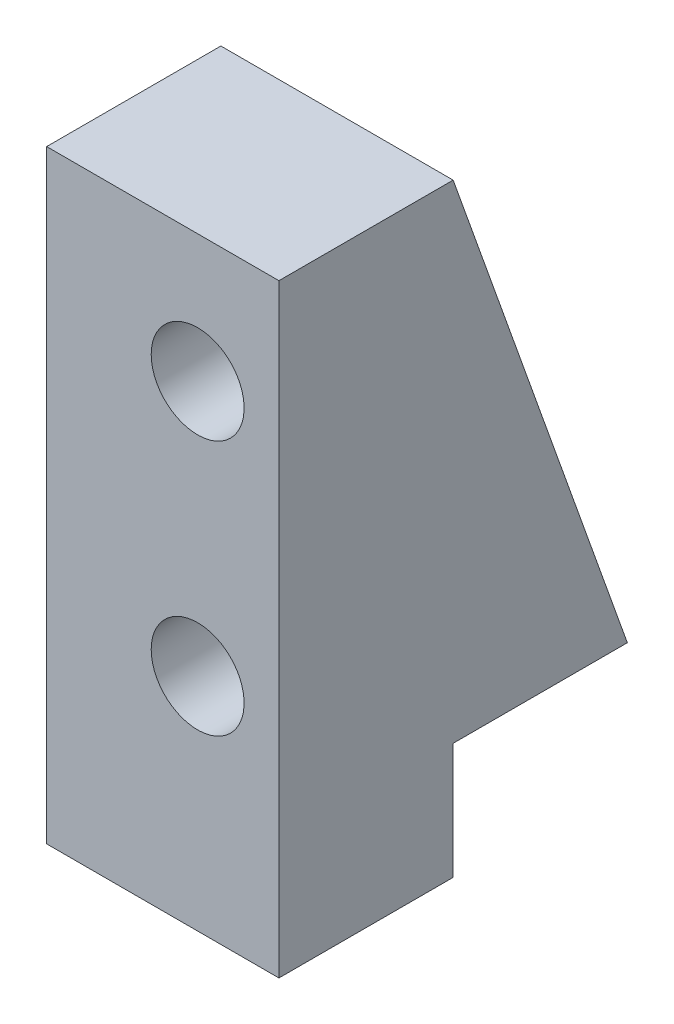
ISO-10303-21;
HEADER;
FILE_DESCRIPTION(('STEP AP214'),'2;1');
FILE_NAME('part.step','',(''),(''),'','','');
FILE_SCHEMA(('AUTOMOTIVE_DESIGN { 1 0 10303 214 1 1 1 1 }'));
ENDSEC;
DATA;
#1=APPLICATION_CONTEXT('core data for automotive mechanical design processes');
#2=APPLICATION_PROTOCOL_DEFINITION('international standard','automotive_design',2000,#1);
#3=PRODUCT_CONTEXT('',#1,'mechanical');
#4=PRODUCT('Part','Part','',(#3));
#5=PRODUCT_RELATED_PRODUCT_CATEGORY('part','',(#4));
#6=PRODUCT_DEFINITION_FORMATION('','',#4);
#7=PRODUCT_DEFINITION_CONTEXT('part definition',#1,'design');
#8=PRODUCT_DEFINITION('design','',#6,#7);
#9=PRODUCT_DEFINITION_SHAPE('','',#8);
#10=(LENGTH_UNIT() NAMED_UNIT(*) SI_UNIT(.MILLI.,.METRE.));
#11=(NAMED_UNIT(*) PLANE_ANGLE_UNIT() SI_UNIT($,.RADIAN.));
#12=(NAMED_UNIT(*) SI_UNIT($,.STERADIAN.) SOLID_ANGLE_UNIT());
#13=UNCERTAINTY_MEASURE_WITH_UNIT(LENGTH_MEASURE(1.E-05),#10,'distance_accuracy_value','');
#14=(GEOMETRIC_REPRESENTATION_CONTEXT(3) GLOBAL_UNCERTAINTY_ASSIGNED_CONTEXT((#13)) GLOBAL_UNIT_ASSIGNED_CONTEXT((#10,
#11,#12)) REPRESENTATION_CONTEXT('',''));
#15=CARTESIAN_POINT('',(0.,0.,0.));
#16=DIRECTION('',(0.,0.,1.));
#17=DIRECTION('',(1.,0.,0.));
#18=AXIS2_PLACEMENT_3D('',#15,#16,#17);
#19=CARTESIAN_POINT('',(-10.0612133972796,52.1,-28.));
#20=DIRECTION('',(0.,0.,1.));
#21=DIRECTION('',(-1.,0.,0.));
#22=AXIS2_PLACEMENT_3D('',#19,#20,#21);
#23=PLANE('',#22);
#24=DIRECTION('',(1.,0.,0.));
#25=VECTOR('',#24,1.);
#26=CARTESIAN_POINT('',(-20.0612133972796,31.1,-28.));
#27=LINE('',#26,#25);
#28=CARTESIAN_POINT('',(-20.0612133972796,31.1,-28.));
#29=VERTEX_POINT('',#28);
#30=CARTESIAN_POINT('',(-10.0612133972796,31.1,-28.));
#31=VERTEX_POINT('',#30);
#32=EDGE_CURVE('E109',#29,#31,#27,.T.);
#33=ORIENTED_EDGE('',*,*,#32,.T.);
#34=DIRECTION('',(0.,-1.,0.));
#35=VECTOR('',#34,1.);
#36=CARTESIAN_POINT('',(-10.0612133972796,52.1,-28.));
#37=LINE('',#36,#35);
#38=CARTESIAN_POINT('',(-10.0612133972796,26.1,-28.));
#39=VERTEX_POINT('',#38);
#40=EDGE_CURVE('E119',#31,#39,#37,.T.);
#41=ORIENTED_EDGE('',*,*,#40,.T.);
#42=DIRECTION('',(1.,0.,0.));
#43=VECTOR('',#42,1.);
#44=CARTESIAN_POINT('',(-36.6612133972796,26.1,-28.));
#45=LINE('',#44,#43);
#46=CARTESIAN_POINT('',(-20.0612133972796,26.1,-28.));
#47=VERTEX_POINT('',#46);
#48=EDGE_CURVE('E11',#47,#39,#45,.T.);
#49=ORIENTED_EDGE('',*,*,#48,.F.);
#50=DIRECTION('',(0.,-1.,0.));
#51=VECTOR('',#50,1.);
#52=CARTESIAN_POINT('',(-20.0612133972796,52.1,-28.));
#53=LINE('',#52,#51);
#54=EDGE_CURVE('E262',#29,#47,#53,.T.);
#55=ORIENTED_EDGE('',*,*,#54,.F.);
#56=EDGE_LOOP('',(#33,#41,#49,#55));
#57=FACE_BOUND('',#56,.T.);
#58=ADVANCED_FACE('F34',(#57),#23,.F.);
#59=CARTESIAN_POINT('',(-13.5604481060977,46.6,-41.5));
#60=DIRECTION('',(0.,0.,1.));
#61=DIRECTION('',(-1.,0.,0.));
#62=AXIS2_PLACEMENT_3D('',#59,#60,#61);
#63=CYLINDRICAL_SURFACE('',#62,2.);
#64=CARTESIAN_POINT('',(-13.5604481060977,46.6,-20.5));
#65=DIRECTION('',(0.,0.,-1.));
#66=DIRECTION('',(-1.,0.,0.));
#67=AXIS2_PLACEMENT_3D('',#64,#65,#66);
#68=CIRCLE('',#67,2.);
#69=CARTESIAN_POINT('',(-15.5604481060977,46.6,-20.5));
#70=VERTEX_POINT('',#69);
#71=EDGE_CURVE('E275',#70,#70,#68,.T.);
#72=ORIENTED_EDGE('',*,*,#71,.F.);
#73=EDGE_LOOP('',(#72));
#74=FACE_BOUND('',#73,.T.);
#75=CARTESIAN_POINT('',(-13.5604481060977,46.6,-29.9642857142857));
#76=DIRECTION('',(0.,-0.336336396998156,0.941741911594837));
#77=DIRECTION('',(0.,0.941741911594837,0.336336396998156));
#78=AXIS2_PLACEMENT_3D('',#75,#76,#77);
#79=ELLIPSE('',#78,2.12372410675979,2.);
#80=CARTESIAN_POINT('',(-13.5604481060977,48.6,-29.25));
#81=VERTEX_POINT('',#80);
#82=EDGE_CURVE('E115',#81,#81,#79,.T.);
#83=ORIENTED_EDGE('',*,*,#82,.F.);
#84=EDGE_LOOP('',(#83));
#85=FACE_BOUND('',#84,.T.);
#86=ADVANCED_FACE('F142',(#74,#85),#63,.F.);
#87=CARTESIAN_POINT('',(-13.5604481060977,35.6,-41.5));
#88=DIRECTION('',(0.,0.,1.));
#89=DIRECTION('',(-1.,0.,0.));
#90=AXIS2_PLACEMENT_3D('',#87,#88,#89);
#91=CYLINDRICAL_SURFACE('',#90,2.);
#92=CARTESIAN_POINT('',(-13.5604481060977,35.6,-20.5));
#93=DIRECTION('',(0.,0.,-1.));
#94=DIRECTION('',(-1.,0.,0.));
#95=AXIS2_PLACEMENT_3D('',#92,#93,#94);
#96=CIRCLE('',#95,2.);
#97=CARTESIAN_POINT('',(-15.5604481060977,35.6,-20.5));
#98=VERTEX_POINT('',#97);
#99=EDGE_CURVE('E274',#98,#98,#96,.T.);
#100=ORIENTED_EDGE('',*,*,#99,.F.);
#101=EDGE_LOOP('',(#100));
#102=FACE_BOUND('',#101,.T.);
#103=CARTESIAN_POINT('',(-13.5604481060977,35.6,-33.8928571428571));
#104=DIRECTION('',(0.,-0.336336396998156,0.941741911594837));
#105=DIRECTION('',(0.,0.941741911594837,0.336336396998156));
#106=AXIS2_PLACEMENT_3D('',#103,#104,#105);
#107=ELLIPSE('',#106,2.12372410675979,2.);
#108=CARTESIAN_POINT('',(-13.5604481060977,37.6,-33.1785714285714));
#109=VERTEX_POINT('',#108);
#110=EDGE_CURVE('E38',#109,#109,#107,.T.);
#111=ORIENTED_EDGE('',*,*,#110,.F.);
#112=EDGE_LOOP('',(#111));
#113=FACE_BOUND('',#112,.T.);
#114=ADVANCED_FACE('F139',(#102,#113),#91,.F.);
#115=CARTESIAN_POINT('',(0.,52.1,0.));
#116=DIRECTION('',(0.,-1.,0.));
#117=DIRECTION('',(0.,0.,-1.));
#118=AXIS2_PLACEMENT_3D('',#115,#116,#117);
#119=PLANE('',#118);
#120=DIRECTION('',(0.,0.,1.));
#121=VECTOR('',#120,1.);
#122=CARTESIAN_POINT('',(-10.0612133972796,52.1,-20.5));
#123=LINE('',#122,#121);
#124=CARTESIAN_POINT('',(-10.0612133972796,52.1,-28.));
#125=VERTEX_POINT('',#124);
#126=CARTESIAN_POINT('',(-10.0612133972796,52.1,-20.5));
#127=VERTEX_POINT('',#126);
#128=EDGE_CURVE('E272',#125,#127,#123,.T.);
#129=ORIENTED_EDGE('',*,*,#128,.F.);
#130=DIRECTION('',(1.,0.,0.));
#131=VECTOR('',#130,1.);
#132=CARTESIAN_POINT('',(-10.0612133972796,52.1,-28.));
#133=LINE('',#132,#131);
#134=CARTESIAN_POINT('',(-20.0612133972796,52.1,-28.));
#135=VERTEX_POINT('',#134);
#136=EDGE_CURVE('E113',#135,#125,#133,.T.);
#137=ORIENTED_EDGE('',*,*,#136,.F.);
#138=DIRECTION('',(0.,0.,-1.));
#139=VECTOR('',#138,1.);
#140=CARTESIAN_POINT('',(-20.0612133972796,52.1,-20.5));
#141=LINE('',#140,#139);
#142=CARTESIAN_POINT('',(-20.0612133972796,52.1,-20.5));
#143=VERTEX_POINT('',#142);
#144=EDGE_CURVE('E258',#143,#135,#141,.T.);
#145=ORIENTED_EDGE('',*,*,#144,.F.);
#146=DIRECTION('',(-1.,0.,0.));
#147=VECTOR('',#146,1.);
#148=CARTESIAN_POINT('',(-10.0612133972796,52.1,-20.5));
#149=LINE('',#148,#147);
#150=EDGE_CURVE('E270',#127,#143,#149,.T.);
#151=ORIENTED_EDGE('',*,*,#150,.F.);
#152=EDGE_LOOP('',(#129,#137,#145,#151));
#153=FACE_BOUND('',#152,.T.);
#154=ADVANCED_FACE('F141',(#153),#119,.F.);
#155=CARTESIAN_POINT('',(-10.0612133972796,52.1,-20.5));
#156=DIRECTION('',(-1.,0.,0.));
#157=DIRECTION('',(0.,0.,-1.));
#158=AXIS2_PLACEMENT_3D('',#155,#156,#157);
#159=PLANE('',#158);
#160=ORIENTED_EDGE('',*,*,#128,.T.);
#161=DIRECTION('',(0.,-1.,0.));
#162=VECTOR('',#161,1.);
#163=CARTESIAN_POINT('',(-10.0612133972796,52.1,-20.5));
#164=LINE('',#163,#162);
#165=CARTESIAN_POINT('',(-10.0612133972796,26.1,-20.5));
#166=VERTEX_POINT('',#165);
#167=EDGE_CURVE('E76',#127,#166,#164,.T.);
#168=ORIENTED_EDGE('',*,*,#167,.T.);
#169=DIRECTION('',(0.,0.,1.));
#170=VECTOR('',#169,1.);
#171=CARTESIAN_POINT('',(-10.0612133972796,26.1,-30.));
#172=LINE('',#171,#170);
#173=EDGE_CURVE('E256',#39,#166,#172,.T.);
#174=ORIENTED_EDGE('',*,*,#173,.F.);
#175=ORIENTED_EDGE('',*,*,#40,.F.);
#176=DIRECTION('',(0.,0.,1.));
#177=VECTOR('',#176,1.);
#178=CARTESIAN_POINT('',(-10.0612133972796,31.1,-28.));
#179=LINE('',#178,#177);
#180=CARTESIAN_POINT('',(-10.0612133972796,31.1,-35.5));
#181=VERTEX_POINT('',#180);
#182=EDGE_CURVE('E107',#181,#31,#179,.T.);
#183=ORIENTED_EDGE('',*,*,#182,.F.);
#184=DIRECTION('',(0.,-0.941741911594837,-0.336336396998156));
#185=VECTOR('',#184,1.);
#186=CARTESIAN_POINT('',(-10.0612133972796,31.1,-35.5));
#187=LINE('',#186,#185);
#188=EDGE_CURVE('E85',#125,#181,#187,.T.);
#189=ORIENTED_EDGE('',*,*,#188,.F.);
#190=EDGE_LOOP('',(#160,#168,#174,#175,#183,#189));
#191=FACE_BOUND('',#190,.T.);
#192=ADVANCED_FACE('F117',(#191),#159,.F.);
#193=CARTESIAN_POINT('',(-10.0612133972796,52.1,-20.5));
#194=DIRECTION('',(0.,0.,-1.));
#195=DIRECTION('',(1.,0.,0.));
#196=AXIS2_PLACEMENT_3D('',#193,#194,#195);
#197=PLANE('',#196);
#198=ORIENTED_EDGE('',*,*,#99,.T.);
#199=EDGE_LOOP('',(#198));
#200=FACE_BOUND('',#199,.T.);
#201=ORIENTED_EDGE('',*,*,#71,.T.);
#202=EDGE_LOOP('',(#201));
#203=FACE_BOUND('',#202,.T.);
#204=ORIENTED_EDGE('',*,*,#167,.F.);
#205=ORIENTED_EDGE('',*,*,#150,.T.);
#206=DIRECTION('',(0.,-1.,0.));
#207=VECTOR('',#206,1.);
#208=CARTESIAN_POINT('',(-20.0612133972796,52.1,-20.5));
#209=LINE('',#208,#207);
#210=CARTESIAN_POINT('',(-20.0612133972796,26.1,-20.5));
#211=VERTEX_POINT('',#210);
#212=EDGE_CURVE('E94',#143,#211,#209,.T.);
#213=ORIENTED_EDGE('',*,*,#212,.T.);
#214=DIRECTION('',(-1.,0.,0.));
#215=VECTOR('',#214,1.);
#216=CARTESIAN_POINT('',(-36.6612133972796,26.1,-20.5));
#217=LINE('',#216,#215);
#218=EDGE_CURVE('E69',#166,#211,#217,.T.);
#219=ORIENTED_EDGE('',*,*,#218,.F.);
#220=EDGE_LOOP('',(#204,#205,#213,#219));
#221=FACE_BOUND('',#220,.T.);
#222=ADVANCED_FACE('F162',(#200,#203,#221),#197,.F.);
#223=CARTESIAN_POINT('',(-20.0612133972796,52.1,-20.5));
#224=DIRECTION('',(1.,0.,0.));
#225=DIRECTION('',(0.,0.,1.));
#226=AXIS2_PLACEMENT_3D('',#223,#224,#225);
#227=PLANE('',#226);
#228=ORIENTED_EDGE('',*,*,#212,.F.);
#229=ORIENTED_EDGE('',*,*,#144,.T.);
#230=DIRECTION('',(0.,-0.941741911594837,-0.336336396998156));
#231=VECTOR('',#230,1.);
#232=CARTESIAN_POINT('',(-20.0612133972796,31.1,-35.5));
#233=LINE('',#232,#231);
#234=CARTESIAN_POINT('',(-20.0612133972796,31.1,-35.5));
#235=VERTEX_POINT('',#234);
#236=EDGE_CURVE('E121',#135,#235,#233,.T.);
#237=ORIENTED_EDGE('',*,*,#236,.T.);
#238=DIRECTION('',(0.,0.,1.));
#239=VECTOR('',#238,1.);
#240=CARTESIAN_POINT('',(-20.0612133972796,31.1,-28.));
#241=LINE('',#240,#239);
#242=EDGE_CURVE('E51',#235,#29,#241,.T.);
#243=ORIENTED_EDGE('',*,*,#242,.T.);
#244=ORIENTED_EDGE('',*,*,#54,.T.);
#245=DIRECTION('',(0.,0.,-1.));
#246=VECTOR('',#245,1.);
#247=CARTESIAN_POINT('',(-20.0612133972796,26.1,-30.));
#248=LINE('',#247,#246);
#249=EDGE_CURVE('E43',#211,#47,#248,.T.);
#250=ORIENTED_EDGE('',*,*,#249,.F.);
#251=EDGE_LOOP('',(#228,#229,#237,#243,#244,#250));
#252=FACE_BOUND('',#251,.T.);
#253=ADVANCED_FACE('F159',(#252),#227,.F.);
#254=CARTESIAN_POINT('',(-36.6612133972796,26.1,-30.));
#255=DIRECTION('',(0.,1.,0.));
#256=DIRECTION('',(0.,0.,1.));
#257=AXIS2_PLACEMENT_3D('',#254,#255,#256);
#258=PLANE('',#257);
#259=ORIENTED_EDGE('',*,*,#48,.T.);
#260=ORIENTED_EDGE('',*,*,#173,.T.);
#261=ORIENTED_EDGE('',*,*,#218,.T.);
#262=ORIENTED_EDGE('',*,*,#249,.T.);
#263=EDGE_LOOP('',(#259,#260,#261,#262));
#264=FACE_BOUND('',#263,.T.);
#265=ADVANCED_FACE('F36',(#264),#258,.F.);
#266=CARTESIAN_POINT('',(-20.0612133972796,31.1,-35.5));
#267=DIRECTION('',(0.,0.336336396998156,-0.941741911594837));
#268=DIRECTION('',(0.,0.941741911594837,0.336336396998156));
#269=AXIS2_PLACEMENT_3D('',#266,#267,#268);
#270=PLANE('',#269);
#271=ORIENTED_EDGE('',*,*,#110,.T.);
#272=EDGE_LOOP('',(#271));
#273=FACE_BOUND('',#272,.T.);
#274=ORIENTED_EDGE('',*,*,#82,.T.);
#275=EDGE_LOOP('',(#274));
#276=FACE_BOUND('',#275,.T.);
#277=ORIENTED_EDGE('',*,*,#188,.T.);
#278=DIRECTION('',(1.,0.,0.));
#279=VECTOR('',#278,1.);
#280=CARTESIAN_POINT('',(-20.0612133972796,31.1,-35.5));
#281=LINE('',#280,#279);
#282=EDGE_CURVE('E100',#235,#181,#281,.T.);
#283=ORIENTED_EDGE('',*,*,#282,.F.);
#284=ORIENTED_EDGE('',*,*,#236,.F.);
#285=ORIENTED_EDGE('',*,*,#136,.T.);
#286=EDGE_LOOP('',(#277,#283,#284,#285));
#287=FACE_BOUND('',#286,.T.);
#288=ADVANCED_FACE('F111',(#273,#276,#287),#270,.T.);
#289=CARTESIAN_POINT('',(-20.0612133972796,31.1,-28.));
#290=DIRECTION('',(0.,-1.,0.));
#291=DIRECTION('',(0.,0.,-1.));
#292=AXIS2_PLACEMENT_3D('',#289,#290,#291);
#293=PLANE('',#292);
#294=ORIENTED_EDGE('',*,*,#182,.T.);
#295=ORIENTED_EDGE('',*,*,#32,.F.);
#296=ORIENTED_EDGE('',*,*,#242,.F.);
#297=ORIENTED_EDGE('',*,*,#282,.T.);
#298=EDGE_LOOP('',(#294,#295,#296,#297));
#299=FACE_BOUND('',#298,.T.);
#300=ADVANCED_FACE('F105',(#299),#293,.T.);
#301=CLOSED_SHELL('',(#58,#86,#114,#154,#192,#222,#253,#265,#288,#300));
#302=MANIFOLD_SOLID_BREP('B2',#301);
#303=ADVANCED_BREP_SHAPE_REPRESENTATION('',(#18,#302),#14);
#304=SHAPE_DEFINITION_REPRESENTATION(#9,#303);
ENDSEC;
END-ISO-10303-21;
